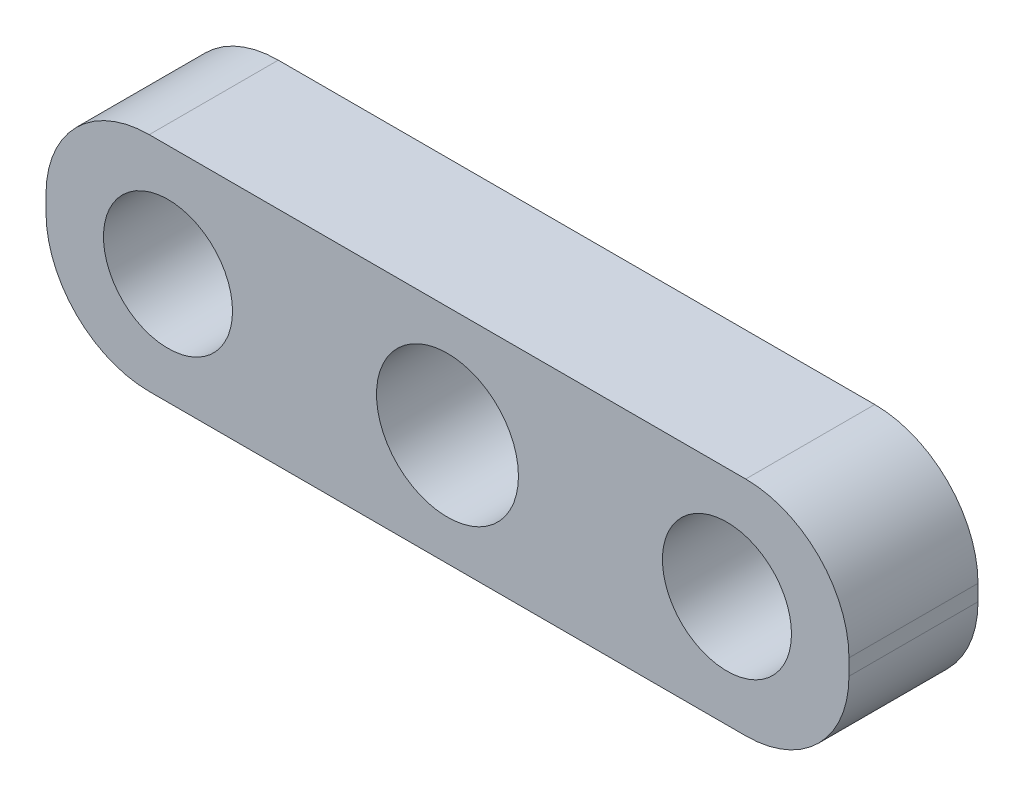
ISO-10303-21;
HEADER;
FILE_DESCRIPTION(('STEP AP214'),'2;1');
FILE_NAME('part.step','',(''),(''),'','','');
FILE_SCHEMA(('AUTOMOTIVE_DESIGN { 1 0 10303 214 1 1 1 1 }'));
ENDSEC;
DATA;
#1=APPLICATION_CONTEXT('core data for automotive mechanical design processes');
#2=APPLICATION_PROTOCOL_DEFINITION('international standard','automotive_design',2000,#1);
#3=PRODUCT_CONTEXT('',#1,'mechanical');
#4=PRODUCT('Part','Part','',(#3));
#5=PRODUCT_RELATED_PRODUCT_CATEGORY('part','',(#4));
#6=PRODUCT_DEFINITION_FORMATION('','',#4);
#7=PRODUCT_DEFINITION_CONTEXT('part definition',#1,'design');
#8=PRODUCT_DEFINITION('design','',#6,#7);
#9=PRODUCT_DEFINITION_SHAPE('','',#8);
#10=(LENGTH_UNIT() NAMED_UNIT(*) SI_UNIT(.MILLI.,.METRE.));
#11=(NAMED_UNIT(*) PLANE_ANGLE_UNIT() SI_UNIT($,.RADIAN.));
#12=(NAMED_UNIT(*) SI_UNIT($,.STERADIAN.) SOLID_ANGLE_UNIT());
#13=UNCERTAINTY_MEASURE_WITH_UNIT(LENGTH_MEASURE(1.E-05),#10,'distance_accuracy_value','');
#14=(GEOMETRIC_REPRESENTATION_CONTEXT(3) GLOBAL_UNCERTAINTY_ASSIGNED_CONTEXT((#13)) GLOBAL_UNIT_ASSIGNED_CONTEXT((#10,
#11,#12)) REPRESENTATION_CONTEXT('',''));
#15=CARTESIAN_POINT('',(0.,0.,0.));
#16=DIRECTION('',(0.,0.,1.));
#17=DIRECTION('',(1.,0.,0.));
#18=AXIS2_PLACEMENT_3D('',#15,#16,#17);
#19=CARTESIAN_POINT('',(0.,14.3718285891,5.));
#20=DIRECTION('',(0.,1.,0.));
#21=DIRECTION('',(-1.,0.,0.));
#22=AXIS2_PLACEMENT_3D('',#19,#20,#21);
#23=PLANE('',#22);
#24=DIRECTION('',(1.,0.,0.));
#25=VECTOR('',#24,1.);
#26=CARTESIAN_POINT('',(0.,14.3718285891,5.));
#27=LINE('',#26,#25);
#28=CARTESIAN_POINT('',(-11.5553349611,14.3718285891,5.));
#29=VERTEX_POINT('',#28);
#30=CARTESIAN_POINT('',(11.5553349610969,14.3718285891,5.));
#31=VERTEX_POINT('',#30);
#32=EDGE_CURVE('E162',#29,#31,#27,.T.);
#33=ORIENTED_EDGE('',*,*,#32,.T.);
#34=DIRECTION('',(0.,0.,-1.));
#35=VECTOR('',#34,1.);
#36=CARTESIAN_POINT('',(11.5553349610969,14.3718285891,0.));
#37=LINE('',#36,#35);
#38=CARTESIAN_POINT('',(11.5553349610969,14.3718285891,0.));
#39=VERTEX_POINT('',#38);
#40=EDGE_CURVE('E115',#31,#39,#37,.T.);
#41=ORIENTED_EDGE('',*,*,#40,.T.);
#42=DIRECTION('',(1.,0.,0.));
#43=VECTOR('',#42,1.);
#44=CARTESIAN_POINT('',(0.,14.3718285891,0.));
#45=LINE('',#44,#43);
#46=CARTESIAN_POINT('',(-11.5553349611,14.3718285891,0.));
#47=VERTEX_POINT('',#46);
#48=EDGE_CURVE('E107',#47,#39,#45,.T.);
#49=ORIENTED_EDGE('',*,*,#48,.F.);
#50=DIRECTION('',(0.,0.,-1.));
#51=VECTOR('',#50,1.);
#52=CARTESIAN_POINT('',(-11.5553349611,14.3718285891,5.));
#53=LINE('',#52,#51);
#54=EDGE_CURVE('E120',#47,#29,#53,.F.);
#55=ORIENTED_EDGE('',*,*,#54,.T.);
#56=EDGE_LOOP('',(#33,#41,#49,#55));
#57=FACE_BOUND('',#56,.T.);
#58=ADVANCED_FACE('F37',(#57),#23,.T.);
#59=CARTESIAN_POINT('',(-15.5553349611,0.,5.));
#60=DIRECTION('',(-1.,0.,0.));
#61=DIRECTION('',(0.,0.,1.));
#62=AXIS2_PLACEMENT_3D('',#59,#60,#61);
#63=PLANE('',#62);
#64=DIRECTION('',(0.,1.,0.));
#65=VECTOR('',#64,1.);
#66=CARTESIAN_POINT('',(-15.5553349611,0.,0.));
#67=LINE('',#66,#65);
#68=CARTESIAN_POINT('',(-15.5553349611,9.7531714109,0.));
#69=VERTEX_POINT('',#68);
#70=CARTESIAN_POINT('',(-15.5553349611,10.3718285891,0.));
#71=VERTEX_POINT('',#70);
#72=EDGE_CURVE('E109',#69,#71,#67,.T.);
#73=ORIENTED_EDGE('',*,*,#72,.F.);
#74=DIRECTION('',(0.,0.,-1.));
#75=VECTOR('',#74,1.);
#76=CARTESIAN_POINT('',(-15.5553349611,9.7531714109,5.));
#77=LINE('',#76,#75);
#78=CARTESIAN_POINT('',(-15.5553349611,9.7531714109,5.));
#79=VERTEX_POINT('',#78);
#80=EDGE_CURVE('E11',#69,#79,#77,.F.);
#81=ORIENTED_EDGE('',*,*,#80,.T.);
#82=DIRECTION('',(0.,1.,0.));
#83=VECTOR('',#82,1.);
#84=CARTESIAN_POINT('',(-15.5553349611,0.,5.));
#85=LINE('',#84,#83);
#86=CARTESIAN_POINT('',(-15.5553349611,10.3718285891,5.));
#87=VERTEX_POINT('',#86);
#88=EDGE_CURVE('E160',#79,#87,#85,.T.);
#89=ORIENTED_EDGE('',*,*,#88,.T.);
#90=DIRECTION('',(0.,0.,-1.));
#91=VECTOR('',#90,1.);
#92=CARTESIAN_POINT('',(-15.5553349611,10.3718285891,5.));
#93=LINE('',#92,#91);
#94=EDGE_CURVE('E45',#87,#71,#93,.T.);
#95=ORIENTED_EDGE('',*,*,#94,.T.);
#96=EDGE_LOOP('',(#73,#81,#89,#95));
#97=FACE_BOUND('',#96,.T.);
#98=ADVANCED_FACE('F158',(#97),#63,.T.);
#99=CARTESIAN_POINT('',(0.,5.7531714109,5.));
#100=DIRECTION('',(0.,1.,0.));
#101=DIRECTION('',(-1.,0.,0.));
#102=AXIS2_PLACEMENT_3D('',#99,#100,#101);
#103=PLANE('',#102);
#104=DIRECTION('',(1.,0.,0.));
#105=VECTOR('',#104,1.);
#106=CARTESIAN_POINT('',(0.,5.7531714109,0.));
#107=LINE('',#106,#105);
#108=CARTESIAN_POINT('',(-11.5553349611,5.7531714109,0.));
#109=VERTEX_POINT('',#108);
#110=CARTESIAN_POINT('',(11.5553349610969,5.7531714109,0.));
#111=VERTEX_POINT('',#110);
#112=EDGE_CURVE('E175',#109,#111,#107,.T.);
#113=ORIENTED_EDGE('',*,*,#112,.T.);
#114=DIRECTION('',(0.,0.,-1.));
#115=VECTOR('',#114,1.);
#116=CARTESIAN_POINT('',(11.5553349610969,5.7531714109,5.));
#117=LINE('',#116,#115);
#118=CARTESIAN_POINT('',(11.5553349610969,5.7531714109,5.));
#119=VERTEX_POINT('',#118);
#120=EDGE_CURVE('E52',#111,#119,#117,.F.);
#121=ORIENTED_EDGE('',*,*,#120,.T.);
#122=DIRECTION('',(1.,0.,0.));
#123=VECTOR('',#122,1.);
#124=CARTESIAN_POINT('',(0.,5.7531714109,5.));
#125=LINE('',#124,#123);
#126=CARTESIAN_POINT('',(-11.5553349611,5.7531714109,5.));
#127=VERTEX_POINT('',#126);
#128=EDGE_CURVE('E161',#127,#119,#125,.T.);
#129=ORIENTED_EDGE('',*,*,#128,.F.);
#130=DIRECTION('',(0.,0.,-1.));
#131=VECTOR('',#130,1.);
#132=CARTESIAN_POINT('',(-11.5553349611,5.7531714109,0.));
#133=LINE('',#132,#131);
#134=EDGE_CURVE('E153',#127,#109,#133,.T.);
#135=ORIENTED_EDGE('',*,*,#134,.T.);
#136=EDGE_LOOP('',(#113,#121,#129,#135));
#137=FACE_BOUND('',#136,.T.);
#138=ADVANCED_FACE('F228',(#137),#103,.F.);
#139=CARTESIAN_POINT('',(15.5553349610969,0.,5.));
#140=DIRECTION('',(-1.,0.,0.));
#141=DIRECTION('',(0.,-1.,0.));
#142=AXIS2_PLACEMENT_3D('',#139,#140,#141);
#143=PLANE('',#142);
#144=DIRECTION('',(0.,1.,0.));
#145=VECTOR('',#144,1.);
#146=CARTESIAN_POINT('',(15.5553349610969,0.,0.));
#147=LINE('',#146,#145);
#148=CARTESIAN_POINT('',(15.5553349610969,9.75317141090001,0.));
#149=VERTEX_POINT('',#148);
#150=CARTESIAN_POINT('',(15.5553349610969,10.3718285891,0.));
#151=VERTEX_POINT('',#150);
#152=EDGE_CURVE('E176',#149,#151,#147,.T.);
#153=ORIENTED_EDGE('',*,*,#152,.T.);
#154=DIRECTION('',(0.,0.,-1.));
#155=VECTOR('',#154,1.);
#156=CARTESIAN_POINT('',(15.5553349610969,10.3718285891,5.));
#157=LINE('',#156,#155);
#158=CARTESIAN_POINT('',(15.5553349610969,10.3718285891,5.));
#159=VERTEX_POINT('',#158);
#160=EDGE_CURVE('E145',#151,#159,#157,.F.);
#161=ORIENTED_EDGE('',*,*,#160,.T.);
#162=DIRECTION('',(0.,1.,0.));
#163=VECTOR('',#162,1.);
#164=CARTESIAN_POINT('',(15.5553349610969,0.,5.));
#165=LINE('',#164,#163);
#166=CARTESIAN_POINT('',(15.5553349610969,9.75317141090001,5.));
#167=VERTEX_POINT('',#166);
#168=EDGE_CURVE('E131',#167,#159,#165,.T.);
#169=ORIENTED_EDGE('',*,*,#168,.F.);
#170=DIRECTION('',(0.,0.,-1.));
#171=VECTOR('',#170,1.);
#172=CARTESIAN_POINT('',(15.5553349610969,9.75317141090001,5.));
#173=LINE('',#172,#171);
#174=EDGE_CURVE('E142',#167,#149,#173,.T.);
#175=ORIENTED_EDGE('',*,*,#174,.T.);
#176=EDGE_LOOP('',(#153,#161,#169,#175));
#177=FACE_BOUND('',#176,.T.);
#178=ADVANCED_FACE('F219',(#177),#143,.F.);
#179=CARTESIAN_POINT('',(-10.8284925017837,10.0625,5.));
#180=DIRECTION('',(0.,0.,-1.));
#181=DIRECTION('',(-1.,0.,0.));
#182=AXIS2_PLACEMENT_3D('',#179,#180,#181);
#183=CYLINDRICAL_SURFACE('',#182,2.49999999998373);
#184=CARTESIAN_POINT('',(-10.8284925017837,10.0625,5.));
#185=DIRECTION('',(0.,0.,1.));
#186=DIRECTION('',(1.,0.,0.));
#187=AXIS2_PLACEMENT_3D('',#184,#185,#186);
#188=CIRCLE('',#187,2.49999999998373);
#189=CARTESIAN_POINT('',(-8.3284925018,10.0625,5.));
#190=VERTEX_POINT('',#189);
#191=EDGE_CURVE('E165',#190,#190,#188,.T.);
#192=ORIENTED_EDGE('',*,*,#191,.T.);
#193=EDGE_LOOP('',(#192));
#194=FACE_BOUND('',#193,.T.);
#195=CARTESIAN_POINT('',(-10.8284925017837,10.0625,0.));
#196=DIRECTION('',(0.,0.,1.));
#197=DIRECTION('',(1.,0.,0.));
#198=AXIS2_PLACEMENT_3D('',#195,#196,#197);
#199=CIRCLE('',#198,2.49999999998373);
#200=CARTESIAN_POINT('',(-8.3284925018,10.0625,0.));
#201=VERTEX_POINT('',#200);
#202=EDGE_CURVE('E123',#201,#201,#199,.T.);
#203=ORIENTED_EDGE('',*,*,#202,.F.);
#204=EDGE_LOOP('',(#203));
#205=FACE_BOUND('',#204,.T.);
#206=ADVANCED_FACE('F214',(#194,#205),#183,.F.);
#207=CARTESIAN_POINT('',(10.8284925017806,10.062499999959,5.));
#208=DIRECTION('',(0.,0.,-1.));
#209=DIRECTION('',(-1.,0.,0.));
#210=AXIS2_PLACEMENT_3D('',#207,#208,#209);
#211=CYLINDRICAL_SURFACE('',#210,2.49999999999275);
#212=CARTESIAN_POINT('',(10.8284925017806,10.062499999959,5.));
#213=DIRECTION('',(0.,0.,1.));
#214=DIRECTION('',(1.,0.,0.));
#215=AXIS2_PLACEMENT_3D('',#212,#213,#214);
#216=CIRCLE('',#215,2.49999999999275);
#217=CARTESIAN_POINT('',(13.3284925017734,10.062499999959,5.));
#218=VERTEX_POINT('',#217);
#219=EDGE_CURVE('E127',#218,#218,#216,.F.);
#220=ORIENTED_EDGE('',*,*,#219,.F.);
#221=EDGE_LOOP('',(#220));
#222=FACE_BOUND('',#221,.T.);
#223=CARTESIAN_POINT('',(10.8284925017806,10.062499999959,0.));
#224=DIRECTION('',(0.,0.,1.));
#225=DIRECTION('',(1.,0.,0.));
#226=AXIS2_PLACEMENT_3D('',#223,#224,#225);
#227=CIRCLE('',#226,2.49999999999275);
#228=CARTESIAN_POINT('',(13.3284925017734,10.062499999959,0.));
#229=VERTEX_POINT('',#228);
#230=EDGE_CURVE('E134',#229,#229,#227,.F.);
#231=ORIENTED_EDGE('',*,*,#230,.T.);
#232=EDGE_LOOP('',(#231));
#233=FACE_BOUND('',#232,.T.);
#234=ADVANCED_FACE('F206',(#222,#233),#211,.F.);
#235=CARTESIAN_POINT('',(0.,0.,5.));
#236=DIRECTION('',(0.,0.,1.));
#237=DIRECTION('',(1.,0.,0.));
#238=AXIS2_PLACEMENT_3D('',#235,#236,#237);
#239=PLANE('',#238);
#240=CARTESIAN_POINT('',(-6.05938910158699E-12,10.0625,5.));
#241=DIRECTION('',(0.,0.,1.));
#242=DIRECTION('',(1.,0.,0.));
#243=AXIS2_PLACEMENT_3D('',#240,#241,#242);
#244=CIRCLE('',#243,2.75);
#245=CARTESIAN_POINT('',(2.74999999999394,10.0625,5.));
#246=VERTEX_POINT('',#245);
#247=EDGE_CURVE('E188',#246,#246,#244,.T.);
#248=ORIENTED_EDGE('',*,*,#247,.F.);
#249=EDGE_LOOP('',(#248));
#250=FACE_BOUND('',#249,.T.);
#251=ORIENTED_EDGE('',*,*,#191,.F.);
#252=EDGE_LOOP('',(#251));
#253=FACE_BOUND('',#252,.T.);
#254=ORIENTED_EDGE('',*,*,#168,.T.);
#255=CARTESIAN_POINT('',(11.5553349610969,10.3718285891,5.));
#256=DIRECTION('',(0.,0.,1.));
#257=DIRECTION('',(1.,0.,0.));
#258=AXIS2_PLACEMENT_3D('',#255,#256,#257);
#259=CIRCLE('',#258,4.);
#260=EDGE_CURVE('E151',#159,#31,#259,.T.);
#261=ORIENTED_EDGE('',*,*,#260,.T.);
#262=ORIENTED_EDGE('',*,*,#32,.F.);
#263=CARTESIAN_POINT('',(-11.5553349611,10.3718285891,5.));
#264=DIRECTION('',(0.,0.,1.));
#265=DIRECTION('',(1.,0.,0.));
#266=AXIS2_PLACEMENT_3D('',#263,#264,#265);
#267=CIRCLE('',#266,4.);
#268=EDGE_CURVE('E126',#29,#87,#267,.T.);
#269=ORIENTED_EDGE('',*,*,#268,.T.);
#270=ORIENTED_EDGE('',*,*,#88,.F.);
#271=CARTESIAN_POINT('',(-11.5553349611,9.7531714109,5.));
#272=DIRECTION('',(0.,0.,1.));
#273=DIRECTION('',(1.,0.,0.));
#274=AXIS2_PLACEMENT_3D('',#271,#272,#273);
#275=CIRCLE('',#274,4.);
#276=EDGE_CURVE('E59',#79,#127,#275,.T.);
#277=ORIENTED_EDGE('',*,*,#276,.T.);
#278=ORIENTED_EDGE('',*,*,#128,.T.);
#279=CARTESIAN_POINT('',(11.5553349610969,9.7531714109,5.));
#280=DIRECTION('',(0.,0.,1.));
#281=DIRECTION('',(1.,0.,0.));
#282=AXIS2_PLACEMENT_3D('',#279,#280,#281);
#283=CIRCLE('',#282,4.);
#284=EDGE_CURVE('E149',#119,#167,#283,.T.);
#285=ORIENTED_EDGE('',*,*,#284,.T.);
#286=EDGE_LOOP('',(#254,#261,#262,#269,#270,#277,#278,#285));
#287=FACE_BOUND('',#286,.T.);
#288=ORIENTED_EDGE('',*,*,#219,.T.);
#289=EDGE_LOOP('',(#288));
#290=FACE_BOUND('',#289,.T.);
#291=ADVANCED_FACE('F203',(#250,#253,#287,#290),#239,.T.);
#292=CARTESIAN_POINT('',(0.,0.,0.));
#293=DIRECTION('',(0.,0.,1.));
#294=DIRECTION('',(1.,0.,0.));
#295=AXIS2_PLACEMENT_3D('',#292,#293,#294);
#296=PLANE('',#295);
#297=CARTESIAN_POINT('',(-6.05938910158699E-12,10.0625,0.));
#298=DIRECTION('',(0.,0.,1.));
#299=DIRECTION('',(1.,0.,0.));
#300=AXIS2_PLACEMENT_3D('',#297,#298,#299);
#301=CIRCLE('',#300,2.75);
#302=CARTESIAN_POINT('',(2.74999999999394,10.0625,0.));
#303=VERTEX_POINT('',#302);
#304=EDGE_CURVE('E172',#303,#303,#301,.T.);
#305=ORIENTED_EDGE('',*,*,#304,.T.);
#306=EDGE_LOOP('',(#305));
#307=FACE_BOUND('',#306,.T.);
#308=ORIENTED_EDGE('',*,*,#202,.T.);
#309=EDGE_LOOP('',(#308));
#310=FACE_BOUND('',#309,.T.);
#311=ORIENTED_EDGE('',*,*,#48,.T.);
#312=CARTESIAN_POINT('',(11.5553349610969,10.3718285891,0.));
#313=DIRECTION('',(0.,0.,1.));
#314=DIRECTION('',(1.,0.,0.));
#315=AXIS2_PLACEMENT_3D('',#312,#313,#314);
#316=CIRCLE('',#315,4.);
#317=EDGE_CURVE('E140',#39,#151,#316,.F.);
#318=ORIENTED_EDGE('',*,*,#317,.T.);
#319=ORIENTED_EDGE('',*,*,#152,.F.);
#320=CARTESIAN_POINT('',(11.5553349610969,9.7531714109,0.));
#321=DIRECTION('',(0.,0.,1.));
#322=DIRECTION('',(1.,0.,0.));
#323=AXIS2_PLACEMENT_3D('',#320,#321,#322);
#324=CIRCLE('',#323,4.);
#325=EDGE_CURVE('E138',#149,#111,#324,.F.);
#326=ORIENTED_EDGE('',*,*,#325,.T.);
#327=ORIENTED_EDGE('',*,*,#112,.F.);
#328=CARTESIAN_POINT('',(-11.5553349611,9.7531714109,0.));
#329=DIRECTION('',(0.,0.,1.));
#330=DIRECTION('',(1.,0.,0.));
#331=AXIS2_PLACEMENT_3D('',#328,#329,#330);
#332=CIRCLE('',#331,4.);
#333=EDGE_CURVE('E114',#109,#69,#332,.F.);
#334=ORIENTED_EDGE('',*,*,#333,.T.);
#335=ORIENTED_EDGE('',*,*,#72,.T.);
#336=CARTESIAN_POINT('',(-11.5553349611,10.3718285891,0.));
#337=DIRECTION('',(0.,0.,1.));
#338=DIRECTION('',(1.,0.,0.));
#339=AXIS2_PLACEMENT_3D('',#336,#337,#338);
#340=CIRCLE('',#339,4.);
#341=EDGE_CURVE('E103',#71,#47,#340,.F.);
#342=ORIENTED_EDGE('',*,*,#341,.T.);
#343=EDGE_LOOP('',(#311,#318,#319,#326,#327,#334,#335,#342));
#344=FACE_BOUND('',#343,.T.);
#345=ORIENTED_EDGE('',*,*,#230,.F.);
#346=EDGE_LOOP('',(#345));
#347=FACE_BOUND('',#346,.T.);
#348=ADVANCED_FACE('F105',(#307,#310,#344,#347),#296,.F.);
#349=CARTESIAN_POINT('',(-6.05938910158699E-12,10.0625,0.));
#350=DIRECTION('',(0.,0.,1.));
#351=DIRECTION('',(1.,0.,0.));
#352=AXIS2_PLACEMENT_3D('',#349,#350,#351);
#353=CYLINDRICAL_SURFACE('',#352,2.75);
#354=ORIENTED_EDGE('',*,*,#304,.F.);
#355=EDGE_LOOP('',(#354));
#356=FACE_BOUND('',#355,.T.);
#357=ORIENTED_EDGE('',*,*,#247,.T.);
#358=EDGE_LOOP('',(#357));
#359=FACE_BOUND('',#358,.T.);
#360=ADVANCED_FACE('F196',(#356,#359),#353,.F.);
#361=CARTESIAN_POINT('',(11.5553349610969,10.3718285891,5.));
#362=DIRECTION('',(0.,0.,1.));
#363=DIRECTION('',(1.,0.,0.));
#364=AXIS2_PLACEMENT_3D('',#361,#362,#363);
#365=CYLINDRICAL_SURFACE('',#364,4.);
#366=ORIENTED_EDGE('',*,*,#260,.F.);
#367=ORIENTED_EDGE('',*,*,#160,.F.);
#368=ORIENTED_EDGE('',*,*,#317,.F.);
#369=ORIENTED_EDGE('',*,*,#40,.F.);
#370=EDGE_LOOP('',(#366,#367,#368,#369));
#371=FACE_BOUND('',#370,.T.);
#372=ADVANCED_FACE('F199',(#371),#365,.T.);
#373=CARTESIAN_POINT('',(11.5553349610969,9.7531714109,5.));
#374=DIRECTION('',(0.,0.,-1.));
#375=DIRECTION('',(-1.,0.,0.));
#376=AXIS2_PLACEMENT_3D('',#373,#374,#375);
#377=CYLINDRICAL_SURFACE('',#376,4.);
#378=ORIENTED_EDGE('',*,*,#284,.F.);
#379=ORIENTED_EDGE('',*,*,#120,.F.);
#380=ORIENTED_EDGE('',*,*,#325,.F.);
#381=ORIENTED_EDGE('',*,*,#174,.F.);
#382=EDGE_LOOP('',(#378,#379,#380,#381));
#383=FACE_BOUND('',#382,.T.);
#384=ADVANCED_FACE('F234',(#383),#377,.T.);
#385=CARTESIAN_POINT('',(-11.5553349611,9.7531714109,5.));
#386=DIRECTION('',(0.,0.,1.));
#387=DIRECTION('',(1.,0.,0.));
#388=AXIS2_PLACEMENT_3D('',#385,#386,#387);
#389=CYLINDRICAL_SURFACE('',#388,4.);
#390=ORIENTED_EDGE('',*,*,#276,.F.);
#391=ORIENTED_EDGE('',*,*,#80,.F.);
#392=ORIENTED_EDGE('',*,*,#333,.F.);
#393=ORIENTED_EDGE('',*,*,#134,.F.);
#394=EDGE_LOOP('',(#390,#391,#392,#393));
#395=FACE_BOUND('',#394,.T.);
#396=ADVANCED_FACE('F237',(#395),#389,.T.);
#397=CARTESIAN_POINT('',(-11.5553349611,10.3718285891,5.));
#398=DIRECTION('',(0.,0.,-1.));
#399=DIRECTION('',(-1.,0.,0.));
#400=AXIS2_PLACEMENT_3D('',#397,#398,#399);
#401=CYLINDRICAL_SURFACE('',#400,4.);
#402=ORIENTED_EDGE('',*,*,#268,.F.);
#403=ORIENTED_EDGE('',*,*,#54,.F.);
#404=ORIENTED_EDGE('',*,*,#341,.F.);
#405=ORIENTED_EDGE('',*,*,#94,.F.);
#406=EDGE_LOOP('',(#402,#403,#404,#405));
#407=FACE_BOUND('',#406,.T.);
#408=ADVANCED_FACE('F39',(#407),#401,.T.);
#409=CLOSED_SHELL('',(#58,#98,#138,#178,#206,#234,#291,#348,#360,#372,#384,#396,#408));
#410=MANIFOLD_SOLID_BREP('B2',#409);
#411=ADVANCED_BREP_SHAPE_REPRESENTATION('',(#18,#410),#14);
#412=SHAPE_DEFINITION_REPRESENTATION(#9,#411);
ENDSEC;
END-ISO-10303-21;
